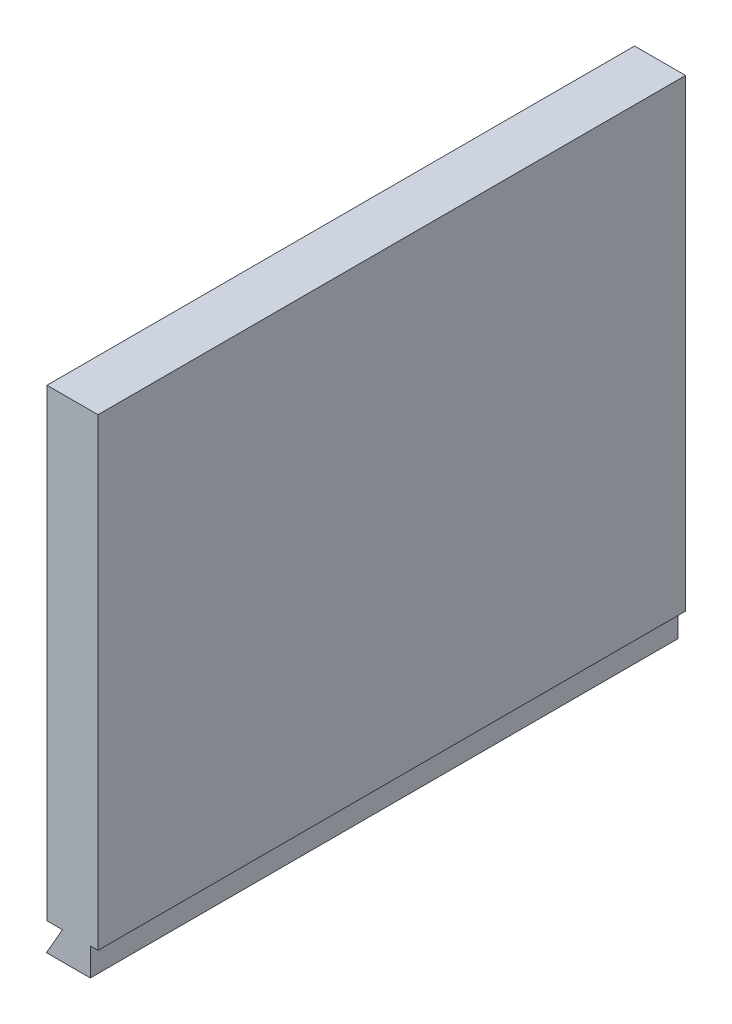
ISO-10303-21;
HEADER;
FILE_DESCRIPTION(('STEP AP214'),'2;1');
FILE_NAME('part.step','',(''),(''),'','','');
FILE_SCHEMA(('AUTOMOTIVE_DESIGN { 1 0 10303 214 1 1 1 1 }'));
ENDSEC;
DATA;
#1=APPLICATION_CONTEXT('core data for automotive mechanical design processes');
#2=APPLICATION_PROTOCOL_DEFINITION('international standard','automotive_design',2000,#1);
#3=PRODUCT_CONTEXT('',#1,'mechanical');
#4=PRODUCT('Part','Part','',(#3));
#5=PRODUCT_RELATED_PRODUCT_CATEGORY('part','',(#4));
#6=PRODUCT_DEFINITION_FORMATION('','',#4);
#7=PRODUCT_DEFINITION_CONTEXT('part definition',#1,'design');
#8=PRODUCT_DEFINITION('design','',#6,#7);
#9=PRODUCT_DEFINITION_SHAPE('','',#8);
#10=(LENGTH_UNIT() NAMED_UNIT(*) SI_UNIT(.MILLI.,.METRE.));
#11=(NAMED_UNIT(*) PLANE_ANGLE_UNIT() SI_UNIT($,.RADIAN.));
#12=(NAMED_UNIT(*) SI_UNIT($,.STERADIAN.) SOLID_ANGLE_UNIT());
#13=UNCERTAINTY_MEASURE_WITH_UNIT(LENGTH_MEASURE(1.E-05),#10,'distance_accuracy_value','');
#14=(GEOMETRIC_REPRESENTATION_CONTEXT(3) GLOBAL_UNCERTAINTY_ASSIGNED_CONTEXT((#13)) GLOBAL_UNIT_ASSIGNED_CONTEXT((#10,
#11,#12)) REPRESENTATION_CONTEXT('',''));
#15=CARTESIAN_POINT('',(0.,0.,0.));
#16=DIRECTION('',(0.,0.,1.));
#17=DIRECTION('',(1.,0.,0.));
#18=AXIS2_PLACEMENT_3D('',#15,#16,#17);
#19=CARTESIAN_POINT('',(-1.03923048454134,-1.8,38.));
#20=DIRECTION('',(0.866025403784436,-0.500000000000004,0.));
#21=DIRECTION('',(0.500000000000004,0.866025403784436,0.));
#22=AXIS2_PLACEMENT_3D('',#19,#20,#21);
#23=PLANE('',#22);
#24=DIRECTION('',(-0.500000000000004,-0.866025403784436,0.));
#25=VECTOR('',#24,1.);
#26=CARTESIAN_POINT('',(-1.03923048454134,-1.8,0.));
#27=LINE('',#26,#25);
#28=CARTESIAN_POINT('',(0.,0.,0.));
#29=VERTEX_POINT('',#28);
#30=CARTESIAN_POINT('',(-1.03923048454134,-1.8,0.));
#31=VERTEX_POINT('',#30);
#32=EDGE_CURVE('E131',#29,#31,#27,.T.);
#33=ORIENTED_EDGE('',*,*,#32,.T.);
#34=DIRECTION('',(0.,0.,-1.));
#35=VECTOR('',#34,1.);
#36=CARTESIAN_POINT('',(-1.03923048454134,-1.8,38.));
#37=LINE('',#36,#35);
#38=CARTESIAN_POINT('',(-1.03923048454134,-1.8,38.));
#39=VERTEX_POINT('',#38);
#40=EDGE_CURVE('E11',#39,#31,#37,.T.);
#41=ORIENTED_EDGE('',*,*,#40,.F.);
#42=DIRECTION('',(-0.500000000000004,-0.866025403784436,0.));
#43=VECTOR('',#42,1.);
#44=CARTESIAN_POINT('',(-1.03923048454134,-1.8,38.));
#45=LINE('',#44,#43);
#46=CARTESIAN_POINT('',(0.,0.,38.));
#47=VERTEX_POINT('',#46);
#48=EDGE_CURVE('E145',#47,#39,#45,.T.);
#49=ORIENTED_EDGE('',*,*,#48,.F.);
#50=DIRECTION('',(0.,0.,-1.));
#51=VECTOR('',#50,1.);
#52=CARTESIAN_POINT('',(0.,0.,38.));
#53=LINE('',#52,#51);
#54=EDGE_CURVE('E127',#47,#29,#53,.T.);
#55=ORIENTED_EDGE('',*,*,#54,.T.);
#56=EDGE_LOOP('',(#33,#41,#49,#55));
#57=FACE_BOUND('',#56,.T.);
#58=ADVANCED_FACE('F35',(#57),#23,.F.);
#59=CARTESIAN_POINT('',(1.8,-1.8,38.));
#60=DIRECTION('',(0.,1.,0.));
#61=DIRECTION('',(-1.,0.,0.));
#62=AXIS2_PLACEMENT_3D('',#59,#60,#61);
#63=PLANE('',#62);
#64=DIRECTION('',(1.,0.,0.));
#65=VECTOR('',#64,1.);
#66=CARTESIAN_POINT('',(1.8,-1.8,0.));
#67=LINE('',#66,#65);
#68=CARTESIAN_POINT('',(1.8,-1.8,0.));
#69=VERTEX_POINT('',#68);
#70=EDGE_CURVE('E134',#31,#69,#67,.T.);
#71=ORIENTED_EDGE('',*,*,#70,.T.);
#72=DIRECTION('',(0.,0.,-1.));
#73=VECTOR('',#72,1.);
#74=CARTESIAN_POINT('',(1.8,-1.8,38.));
#75=LINE('',#74,#73);
#76=CARTESIAN_POINT('',(1.8,-1.8,38.));
#77=VERTEX_POINT('',#76);
#78=EDGE_CURVE('E43',#77,#69,#75,.T.);
#79=ORIENTED_EDGE('',*,*,#78,.F.);
#80=DIRECTION('',(1.,0.,0.));
#81=VECTOR('',#80,1.);
#82=CARTESIAN_POINT('',(1.8,-1.8,38.));
#83=LINE('',#82,#81);
#84=EDGE_CURVE('E94',#39,#77,#83,.T.);
#85=ORIENTED_EDGE('',*,*,#84,.F.);
#86=ORIENTED_EDGE('',*,*,#40,.T.);
#87=EDGE_LOOP('',(#71,#79,#85,#86));
#88=FACE_BOUND('',#87,.T.);
#89=ADVANCED_FACE('F180',(#88),#63,.F.);
#90=CARTESIAN_POINT('',(1.8,0.,38.));
#91=DIRECTION('',(-1.,0.,0.));
#92=DIRECTION('',(0.,-1.,0.));
#93=AXIS2_PLACEMENT_3D('',#90,#91,#92);
#94=PLANE('',#93);
#95=DIRECTION('',(0.,1.,0.));
#96=VECTOR('',#95,1.);
#97=CARTESIAN_POINT('',(1.8,0.,0.));
#98=LINE('',#97,#96);
#99=CARTESIAN_POINT('',(1.8,0.,0.));
#100=VERTEX_POINT('',#99);
#101=EDGE_CURVE('E136',#69,#100,#98,.T.);
#102=ORIENTED_EDGE('',*,*,#101,.T.);
#103=DIRECTION('',(0.,0.,-1.));
#104=VECTOR('',#103,1.);
#105=CARTESIAN_POINT('',(1.8,0.,38.));
#106=LINE('',#105,#104);
#107=CARTESIAN_POINT('',(1.8,0.,38.));
#108=VERTEX_POINT('',#107);
#109=EDGE_CURVE('E152',#108,#100,#106,.T.);
#110=ORIENTED_EDGE('',*,*,#109,.F.);
#111=DIRECTION('',(0.,1.,0.));
#112=VECTOR('',#111,1.);
#113=CARTESIAN_POINT('',(1.8,0.,38.));
#114=LINE('',#113,#112);
#115=EDGE_CURVE('E160',#77,#108,#114,.T.);
#116=ORIENTED_EDGE('',*,*,#115,.F.);
#117=ORIENTED_EDGE('',*,*,#78,.T.);
#118=EDGE_LOOP('',(#102,#110,#116,#117));
#119=FACE_BOUND('',#118,.T.);
#120=ADVANCED_FACE('F158',(#119),#94,.F.);
#121=CARTESIAN_POINT('',(2.3,0.,38.));
#122=DIRECTION('',(0.,1.,0.));
#123=DIRECTION('',(-1.,0.,0.));
#124=AXIS2_PLACEMENT_3D('',#121,#122,#123);
#125=PLANE('',#124);
#126=DIRECTION('',(1.,0.,0.));
#127=VECTOR('',#126,1.);
#128=CARTESIAN_POINT('',(2.3,0.,0.));
#129=LINE('',#128,#127);
#130=CARTESIAN_POINT('',(2.3,0.,0.));
#131=VERTEX_POINT('',#130);
#132=EDGE_CURVE('E138',#100,#131,#129,.T.);
#133=ORIENTED_EDGE('',*,*,#132,.T.);
#134=DIRECTION('',(0.,0.,-1.));
#135=VECTOR('',#134,1.);
#136=CARTESIAN_POINT('',(2.3,0.,38.));
#137=LINE('',#136,#135);
#138=CARTESIAN_POINT('',(2.3,0.,38.));
#139=VERTEX_POINT('',#138);
#140=EDGE_CURVE('E149',#139,#131,#137,.T.);
#141=ORIENTED_EDGE('',*,*,#140,.F.);
#142=DIRECTION('',(1.,0.,0.));
#143=VECTOR('',#142,1.);
#144=CARTESIAN_POINT('',(2.3,0.,38.));
#145=LINE('',#144,#143);
#146=EDGE_CURVE('E172',#108,#139,#145,.T.);
#147=ORIENTED_EDGE('',*,*,#146,.F.);
#148=ORIENTED_EDGE('',*,*,#109,.T.);
#149=EDGE_LOOP('',(#133,#141,#147,#148));
#150=FACE_BOUND('',#149,.T.);
#151=ADVANCED_FACE('F168',(#150),#125,.F.);
#152=CARTESIAN_POINT('',(2.3,30.,38.));
#153=DIRECTION('',(-1.,0.,0.));
#154=DIRECTION('',(0.,-1.,0.));
#155=AXIS2_PLACEMENT_3D('',#152,#153,#154);
#156=PLANE('',#155);
#157=DIRECTION('',(0.,1.,0.));
#158=VECTOR('',#157,1.);
#159=CARTESIAN_POINT('',(2.3,30.,0.));
#160=LINE('',#159,#158);
#161=CARTESIAN_POINT('',(2.3,30.,0.));
#162=VERTEX_POINT('',#161);
#163=EDGE_CURVE('E140',#131,#162,#160,.T.);
#164=ORIENTED_EDGE('',*,*,#163,.T.);
#165=DIRECTION('',(0.,0.,-1.));
#166=VECTOR('',#165,1.);
#167=CARTESIAN_POINT('',(2.3,30.,38.));
#168=LINE('',#167,#166);
#169=CARTESIAN_POINT('',(2.3,30.,38.));
#170=VERTEX_POINT('',#169);
#171=EDGE_CURVE('E122',#170,#162,#168,.T.);
#172=ORIENTED_EDGE('',*,*,#171,.F.);
#173=DIRECTION('',(0.,1.,0.));
#174=VECTOR('',#173,1.);
#175=CARTESIAN_POINT('',(2.3,30.,38.));
#176=LINE('',#175,#174);
#177=EDGE_CURVE('E113',#139,#170,#176,.T.);
#178=ORIENTED_EDGE('',*,*,#177,.F.);
#179=ORIENTED_EDGE('',*,*,#140,.T.);
#180=EDGE_LOOP('',(#164,#172,#178,#179));
#181=FACE_BOUND('',#180,.T.);
#182=ADVANCED_FACE('F171',(#181),#156,.F.);
#183=CARTESIAN_POINT('',(-1.,30.,38.));
#184=DIRECTION('',(0.,-1.,0.));
#185=DIRECTION('',(0.,0.,-1.));
#186=AXIS2_PLACEMENT_3D('',#183,#184,#185);
#187=PLANE('',#186);
#188=DIRECTION('',(-1.,0.,0.));
#189=VECTOR('',#188,1.);
#190=CARTESIAN_POINT('',(-1.,30.,0.));
#191=LINE('',#190,#189);
#192=CARTESIAN_POINT('',(-1.,30.,0.));
#193=VERTEX_POINT('',#192);
#194=EDGE_CURVE('E121',#162,#193,#191,.T.);
#195=ORIENTED_EDGE('',*,*,#194,.T.);
#196=DIRECTION('',(0.,0.,-1.));
#197=VECTOR('',#196,1.);
#198=CARTESIAN_POINT('',(-1.,30.,38.));
#199=LINE('',#198,#197);
#200=CARTESIAN_POINT('',(-1.,30.,38.));
#201=VERTEX_POINT('',#200);
#202=EDGE_CURVE('E118',#201,#193,#199,.T.);
#203=ORIENTED_EDGE('',*,*,#202,.F.);
#204=DIRECTION('',(-1.,0.,0.));
#205=VECTOR('',#204,1.);
#206=CARTESIAN_POINT('',(-1.,30.,38.));
#207=LINE('',#206,#205);
#208=EDGE_CURVE('E107',#170,#201,#207,.T.);
#209=ORIENTED_EDGE('',*,*,#208,.F.);
#210=ORIENTED_EDGE('',*,*,#171,.T.);
#211=EDGE_LOOP('',(#195,#203,#209,#210));
#212=FACE_BOUND('',#211,.T.);
#213=ADVANCED_FACE('F119',(#212),#187,.F.);
#214=CARTESIAN_POINT('',(-1.,0.,38.));
#215=DIRECTION('',(1.,0.,0.));
#216=DIRECTION('',(0.,0.,-1.));
#217=AXIS2_PLACEMENT_3D('',#214,#215,#216);
#218=PLANE('',#217);
#219=DIRECTION('',(0.,-1.,0.));
#220=VECTOR('',#219,1.);
#221=CARTESIAN_POINT('',(-1.,0.,0.));
#222=LINE('',#221,#220);
#223=CARTESIAN_POINT('',(-1.,0.,0.));
#224=VERTEX_POINT('',#223);
#225=EDGE_CURVE('E80',#193,#224,#222,.T.);
#226=ORIENTED_EDGE('',*,*,#225,.T.);
#227=DIRECTION('',(0.,0.,-1.));
#228=VECTOR('',#227,1.);
#229=CARTESIAN_POINT('',(-1.,0.,38.));
#230=LINE('',#229,#228);
#231=CARTESIAN_POINT('',(-1.,0.,38.));
#232=VERTEX_POINT('',#231);
#233=EDGE_CURVE('E123',#232,#224,#230,.T.);
#234=ORIENTED_EDGE('',*,*,#233,.F.);
#235=DIRECTION('',(0.,-1.,0.));
#236=VECTOR('',#235,1.);
#237=CARTESIAN_POINT('',(-1.,0.,38.));
#238=LINE('',#237,#236);
#239=EDGE_CURVE('E111',#201,#232,#238,.T.);
#240=ORIENTED_EDGE('',*,*,#239,.F.);
#241=ORIENTED_EDGE('',*,*,#202,.T.);
#242=EDGE_LOOP('',(#226,#234,#240,#241));
#243=FACE_BOUND('',#242,.T.);
#244=ADVANCED_FACE('F125',(#243),#218,.F.);
#245=CARTESIAN_POINT('',(0.,0.,38.));
#246=DIRECTION('',(0.,1.,0.));
#247=DIRECTION('',(-1.,0.,0.));
#248=AXIS2_PLACEMENT_3D('',#245,#246,#247);
#249=PLANE('',#248);
#250=DIRECTION('',(1.,0.,0.));
#251=VECTOR('',#250,1.);
#252=CARTESIAN_POINT('',(0.,0.,0.));
#253=LINE('',#252,#251);
#254=EDGE_CURVE('E86',#224,#29,#253,.T.);
#255=ORIENTED_EDGE('',*,*,#254,.T.);
#256=ORIENTED_EDGE('',*,*,#54,.F.);
#257=DIRECTION('',(1.,0.,0.));
#258=VECTOR('',#257,1.);
#259=CARTESIAN_POINT('',(0.,0.,38.));
#260=LINE('',#259,#258);
#261=EDGE_CURVE('E51',#232,#47,#260,.T.);
#262=ORIENTED_EDGE('',*,*,#261,.F.);
#263=ORIENTED_EDGE('',*,*,#233,.T.);
#264=EDGE_LOOP('',(#255,#256,#262,#263));
#265=FACE_BOUND('',#264,.T.);
#266=ADVANCED_FACE('F196',(#265),#249,.F.);
#267=CARTESIAN_POINT('',(0.,0.,38.));
#268=DIRECTION('',(0.,0.,1.));
#269=DIRECTION('',(1.,0.,0.));
#270=AXIS2_PLACEMENT_3D('',#267,#268,#269);
#271=PLANE('',#270);
#272=ORIENTED_EDGE('',*,*,#48,.T.);
#273=ORIENTED_EDGE('',*,*,#84,.T.);
#274=ORIENTED_EDGE('',*,*,#115,.T.);
#275=ORIENTED_EDGE('',*,*,#146,.T.);
#276=ORIENTED_EDGE('',*,*,#177,.T.);
#277=ORIENTED_EDGE('',*,*,#208,.T.);
#278=ORIENTED_EDGE('',*,*,#239,.T.);
#279=ORIENTED_EDGE('',*,*,#261,.T.);
#280=EDGE_LOOP('',(#272,#273,#274,#275,#276,#277,#278,#279));
#281=FACE_BOUND('',#280,.T.);
#282=ADVANCED_FACE('F109',(#281),#271,.T.);
#283=CARTESIAN_POINT('',(0.,0.,0.));
#284=DIRECTION('',(0.,0.,1.));
#285=DIRECTION('',(1.,0.,0.));
#286=AXIS2_PLACEMENT_3D('',#283,#284,#285);
#287=PLANE('',#286);
#288=ORIENTED_EDGE('',*,*,#32,.F.);
#289=ORIENTED_EDGE('',*,*,#254,.F.);
#290=ORIENTED_EDGE('',*,*,#225,.F.);
#291=ORIENTED_EDGE('',*,*,#194,.F.);
#292=ORIENTED_EDGE('',*,*,#163,.F.);
#293=ORIENTED_EDGE('',*,*,#132,.F.);
#294=ORIENTED_EDGE('',*,*,#101,.F.);
#295=ORIENTED_EDGE('',*,*,#70,.F.);
#296=EDGE_LOOP('',(#288,#289,#290,#291,#292,#293,#294,#295));
#297=FACE_BOUND('',#296,.T.);
#298=ADVANCED_FACE('F164',(#297),#287,.F.);
#299=CLOSED_SHELL('',(#58,#89,#120,#151,#182,#213,#244,#266,#282,#298));
#300=MANIFOLD_SOLID_BREP('B2',#299);
#301=ADVANCED_BREP_SHAPE_REPRESENTATION('',(#18,#300),#14);
#302=SHAPE_DEFINITION_REPRESENTATION(#9,#301);
ENDSEC;
END-ISO-10303-21;
